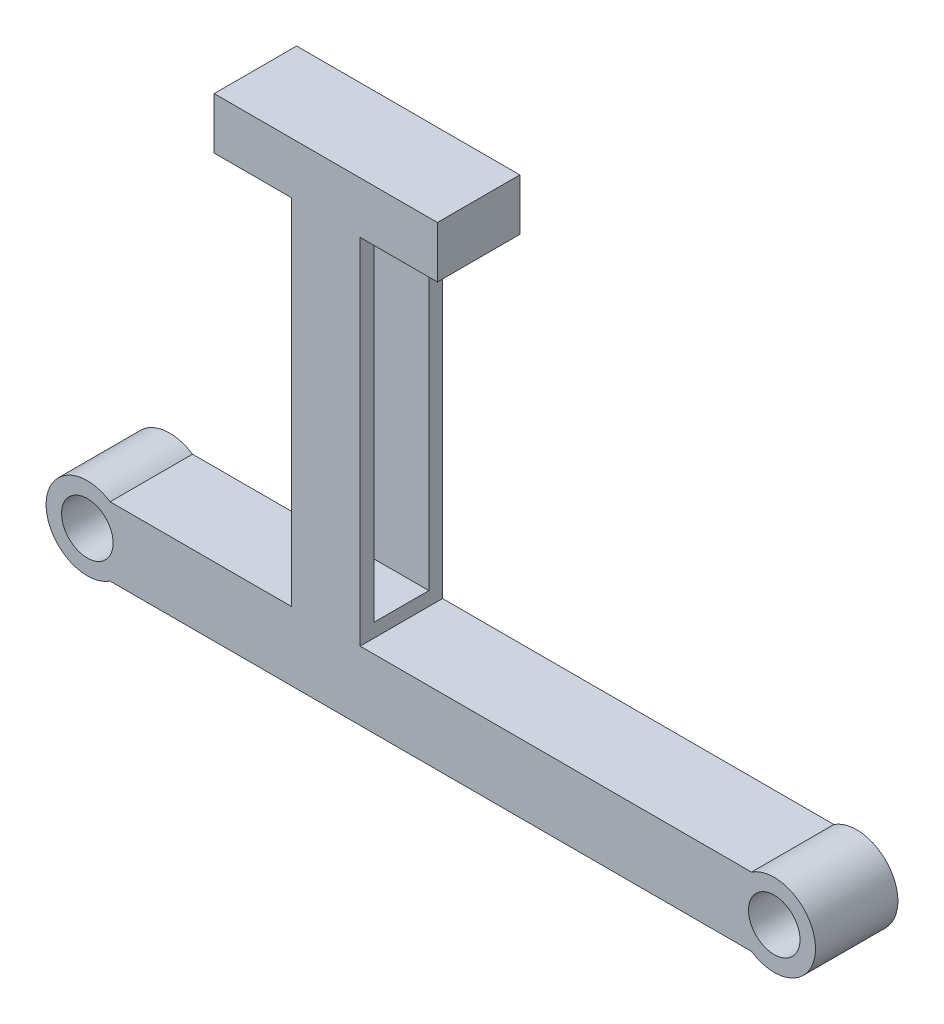
ISO-10303-21;
HEADER;
FILE_DESCRIPTION(('STEP AP214'),'2;1');
FILE_NAME('part.step','',(''),(''),'','','');
FILE_SCHEMA(('AUTOMOTIVE_DESIGN { 1 0 10303 214 1 1 1 1 }'));
ENDSEC;
DATA;
#1=APPLICATION_CONTEXT('core data for automotive mechanical design processes');
#2=APPLICATION_PROTOCOL_DEFINITION('international standard','automotive_design',2000,#1);
#3=PRODUCT_CONTEXT('',#1,'mechanical');
#4=PRODUCT('Part','Part','',(#3));
#5=PRODUCT_RELATED_PRODUCT_CATEGORY('part','',(#4));
#6=PRODUCT_DEFINITION_FORMATION('','',#4);
#7=PRODUCT_DEFINITION_CONTEXT('part definition',#1,'design');
#8=PRODUCT_DEFINITION('design','',#6,#7);
#9=PRODUCT_DEFINITION_SHAPE('','',#8);
#10=(LENGTH_UNIT() NAMED_UNIT(*) SI_UNIT(.MILLI.,.METRE.));
#11=(NAMED_UNIT(*) PLANE_ANGLE_UNIT() SI_UNIT($,.RADIAN.));
#12=(NAMED_UNIT(*) SI_UNIT($,.STERADIAN.) SOLID_ANGLE_UNIT());
#13=UNCERTAINTY_MEASURE_WITH_UNIT(LENGTH_MEASURE(1.E-05),#10,'distance_accuracy_value','');
#14=(GEOMETRIC_REPRESENTATION_CONTEXT(3) GLOBAL_UNCERTAINTY_ASSIGNED_CONTEXT((#13)) GLOBAL_UNIT_ASSIGNED_CONTEXT((#10,
#11,#12)) REPRESENTATION_CONTEXT('',''));
#15=CARTESIAN_POINT('',(0.,0.,0.));
#16=DIRECTION('',(0.,0.,1.));
#17=DIRECTION('',(1.,0.,0.));
#18=AXIS2_PLACEMENT_3D('',#15,#16,#17);
#19=CARTESIAN_POINT('',(144.282113555684,-3.25265389483817,12.));
#20=DIRECTION('',(0.,0.,-1.));
#21=DIRECTION('',(-1.,0.,0.));
#22=AXIS2_PLACEMENT_3D('',#19,#20,#21);
#23=CYLINDRICAL_SURFACE('',#22,7.50000000000001);
#24=CARTESIAN_POINT('',(144.282113555684,-3.25265389483817,12.));
#25=DIRECTION('',(0.,0.,1.));
#26=DIRECTION('',(1.,0.,0.));
#27=AXIS2_PLACEMENT_3D('',#24,#25,#26);
#28=CIRCLE('',#27,7.50000000000001);
#29=CARTESIAN_POINT('',(151.782113555684,-3.25265389483817,12.));
#30=VERTEX_POINT('',#29);
#31=EDGE_CURVE('E478',#30,#30,#28,.T.);
#32=ORIENTED_EDGE('',*,*,#31,.T.);
#33=EDGE_LOOP('',(#32));
#34=FACE_BOUND('',#33,.T.);
#35=CARTESIAN_POINT('',(144.282113555684,-3.25265389483817,-12.));
#36=DIRECTION('',(0.,0.,1.));
#37=DIRECTION('',(1.,0.,0.));
#38=AXIS2_PLACEMENT_3D('',#35,#36,#37);
#39=CIRCLE('',#38,7.50000000000001);
#40=CARTESIAN_POINT('',(151.782113555684,-3.25265389483817,-12.));
#41=VERTEX_POINT('',#40);
#42=EDGE_CURVE('E483',#41,#41,#39,.T.);
#43=ORIENTED_EDGE('',*,*,#42,.F.);
#44=EDGE_LOOP('',(#43));
#45=FACE_BOUND('',#44,.T.);
#46=ADVANCED_FACE('F277',(#34,#45),#23,.F.);
#47=CARTESIAN_POINT('',(-55.7178864443161,-3.25265389483817,12.));
#48=DIRECTION('',(0.,0.,-1.));
#49=DIRECTION('',(-1.,0.,0.));
#50=AXIS2_PLACEMENT_3D('',#47,#48,#49);
#51=CYLINDRICAL_SURFACE('',#50,7.5);
#52=CARTESIAN_POINT('',(-55.7178864443161,-3.25265389483817,12.));
#53=DIRECTION('',(0.,0.,1.));
#54=DIRECTION('',(1.,0.,0.));
#55=AXIS2_PLACEMENT_3D('',#52,#53,#54);
#56=CIRCLE('',#55,7.5);
#57=CARTESIAN_POINT('',(-48.2178864443161,-3.25265389483817,12.));
#58=VERTEX_POINT('',#57);
#59=EDGE_CURVE('E467',#58,#58,#56,.T.);
#60=ORIENTED_EDGE('',*,*,#59,.T.);
#61=EDGE_LOOP('',(#60));
#62=FACE_BOUND('',#61,.T.);
#63=CARTESIAN_POINT('',(-55.7178864443161,-3.25265389483817,-12.));
#64=DIRECTION('',(0.,0.,1.));
#65=DIRECTION('',(1.,0.,0.));
#66=AXIS2_PLACEMENT_3D('',#63,#64,#65);
#67=CIRCLE('',#66,7.5);
#68=CARTESIAN_POINT('',(-48.2178864443161,-3.25265389483817,-12.));
#69=VERTEX_POINT('',#68);
#70=EDGE_CURVE('E472',#69,#69,#67,.T.);
#71=ORIENTED_EDGE('',*,*,#70,.F.);
#72=EDGE_LOOP('',(#71));
#73=FACE_BOUND('',#72,.T.);
#74=ADVANCED_FACE('F584',(#62,#73),#51,.F.);
#75=CARTESIAN_POINT('',(-55.7178864443161,-3.25265389483817,12.));
#76=DIRECTION('',(0.,0.,-1.));
#77=DIRECTION('',(-1.,0.,0.));
#78=AXIS2_PLACEMENT_3D('',#75,#76,#77);
#79=CYLINDRICAL_SURFACE('',#78,12.);
#80=CARTESIAN_POINT('',(-55.7178864443161,-3.25265389483817,-12.));
#81=DIRECTION('',(0.,0.,1.));
#82=DIRECTION('',(1.,0.,0.));
#83=AXIS2_PLACEMENT_3D('',#80,#81,#82);
#84=CIRCLE('',#83,12.);
#85=CARTESIAN_POINT('',(-49.0846368636053,6.74734610516182,-12.));
#86=VERTEX_POINT('',#85);
#87=CARTESIAN_POINT('',(-49.0846368636054,-13.2526538948382,-12.));
#88=VERTEX_POINT('',#87);
#89=EDGE_CURVE('E470',#86,#88,#84,.T.);
#90=ORIENTED_EDGE('',*,*,#89,.T.);
#91=DIRECTION('',(0.,0.,1.));
#92=VECTOR('',#91,1.);
#93=CARTESIAN_POINT('',(-49.0846368636054,-13.2526538948382,-12.));
#94=LINE('',#93,#92);
#95=CARTESIAN_POINT('',(-49.0846368636054,-13.2526538948382,12.));
#96=VERTEX_POINT('',#95);
#97=EDGE_CURVE('E448',#88,#96,#94,.T.);
#98=ORIENTED_EDGE('',*,*,#97,.T.);
#99=CARTESIAN_POINT('',(-55.7178864443161,-3.25265389483817,12.));
#100=DIRECTION('',(0.,0.,1.));
#101=DIRECTION('',(1.,0.,0.));
#102=AXIS2_PLACEMENT_3D('',#99,#100,#101);
#103=CIRCLE('',#102,12.);
#104=CARTESIAN_POINT('',(-49.0846368636053,6.74734610516183,12.));
#105=VERTEX_POINT('',#104);
#106=EDGE_CURVE('E464',#105,#96,#103,.T.);
#107=ORIENTED_EDGE('',*,*,#106,.F.);
#108=DIRECTION('',(0.,0.,1.));
#109=VECTOR('',#108,1.);
#110=CARTESIAN_POINT('',(-49.0846368636053,6.74734610516183,-12.));
#111=LINE('',#110,#109);
#112=EDGE_CURVE('E445',#86,#105,#111,.T.);
#113=ORIENTED_EDGE('',*,*,#112,.F.);
#114=EDGE_LOOP('',(#90,#98,#107,#113));
#115=FACE_BOUND('',#114,.T.);
#116=ADVANCED_FACE('F582',(#115),#79,.T.);
#117=CARTESIAN_POINT('',(144.282113555684,-3.25265389483817,12.));
#118=DIRECTION('',(0.,0.,-1.));
#119=DIRECTION('',(-1.,0.,0.));
#120=AXIS2_PLACEMENT_3D('',#117,#118,#119);
#121=CYLINDRICAL_SURFACE('',#120,12.);
#122=CARTESIAN_POINT('',(144.282113555684,-3.25265389483817,12.));
#123=DIRECTION('',(0.,0.,1.));
#124=DIRECTION('',(1.,0.,0.));
#125=AXIS2_PLACEMENT_3D('',#122,#123,#124);
#126=CIRCLE('',#125,12.);
#127=CARTESIAN_POINT('',(137.648863974973,-13.2526538948382,12.));
#128=VERTEX_POINT('',#127);
#129=CARTESIAN_POINT('',(137.648863974973,6.74734610516184,12.));
#130=VERTEX_POINT('',#129);
#131=EDGE_CURVE('E475',#128,#130,#126,.T.);
#132=ORIENTED_EDGE('',*,*,#131,.F.);
#133=DIRECTION('',(0.,0.,1.));
#134=VECTOR('',#133,1.);
#135=CARTESIAN_POINT('',(137.648863974973,-13.2526538948382,-12.));
#136=LINE('',#135,#134);
#137=CARTESIAN_POINT('',(137.648863974973,-13.2526538948382,-12.));
#138=VERTEX_POINT('',#137);
#139=EDGE_CURVE('E392',#138,#128,#136,.T.);
#140=ORIENTED_EDGE('',*,*,#139,.F.);
#141=CARTESIAN_POINT('',(144.282113555684,-3.25265389483817,-12.));
#142=DIRECTION('',(0.,0.,1.));
#143=DIRECTION('',(1.,0.,0.));
#144=AXIS2_PLACEMENT_3D('',#141,#142,#143);
#145=CIRCLE('',#144,12.);
#146=CARTESIAN_POINT('',(137.648863974973,6.74734610516184,-12.));
#147=VERTEX_POINT('',#146);
#148=EDGE_CURVE('E481',#138,#147,#145,.T.);
#149=ORIENTED_EDGE('',*,*,#148,.T.);
#150=DIRECTION('',(0.,0.,1.));
#151=VECTOR('',#150,1.);
#152=CARTESIAN_POINT('',(137.648863974973,6.74734610516183,-12.));
#153=LINE('',#152,#151);
#154=EDGE_CURVE('E443',#147,#130,#153,.T.);
#155=ORIENTED_EDGE('',*,*,#154,.T.);
#156=EDGE_LOOP('',(#132,#140,#149,#155));
#157=FACE_BOUND('',#156,.T.);
#158=ADVANCED_FACE('F575',(#157),#121,.T.);
#159=CARTESIAN_POINT('',(0.,-13.2526538948382,-12.));
#160=DIRECTION('',(0.,1.,0.));
#161=DIRECTION('',(-1.,0.,0.));
#162=AXIS2_PLACEMENT_3D('',#159,#160,#161);
#163=PLANE('',#162);
#164=ORIENTED_EDGE('',*,*,#139,.T.);
#165=DIRECTION('',(-1.,0.,0.));
#166=VECTOR('',#165,1.);
#167=CARTESIAN_POINT('',(0.,-13.2526538948382,12.));
#168=LINE('',#167,#166);
#169=EDGE_CURVE('E457',#128,#96,#168,.T.);
#170=ORIENTED_EDGE('',*,*,#169,.T.);
#171=ORIENTED_EDGE('',*,*,#97,.F.);
#172=DIRECTION('',(-1.,0.,0.));
#173=VECTOR('',#172,1.);
#174=CARTESIAN_POINT('',(0.,-13.2526538948382,-12.));
#175=LINE('',#174,#173);
#176=EDGE_CURVE('E446',#138,#88,#175,.T.);
#177=ORIENTED_EDGE('',*,*,#176,.F.);
#178=EDGE_LOOP('',(#164,#170,#171,#177));
#179=FACE_BOUND('',#178,.T.);
#180=ADVANCED_FACE('F580',(#179),#163,.F.);
#181=CARTESIAN_POINT('',(0.,0.,12.));
#182=DIRECTION('',(0.,0.,1.));
#183=DIRECTION('',(1.,0.,0.));
#184=AXIS2_PLACEMENT_3D('',#181,#182,#183);
#185=PLANE('',#184);
#186=ORIENTED_EDGE('',*,*,#169,.F.);
#187=ORIENTED_EDGE('',*,*,#131,.T.);
#188=DIRECTION('',(1.,0.,0.));
#189=VECTOR('',#188,1.);
#190=CARTESIAN_POINT('',(0.,6.74734610516183,12.));
#191=LINE('',#190,#189);
#192=CARTESIAN_POINT('',(23.7121135556839,6.7473461051618,12.));
#193=VERTEX_POINT('',#192);
#194=EDGE_CURVE('E463',#193,#130,#191,.T.);
#195=ORIENTED_EDGE('',*,*,#194,.F.);
#196=DIRECTION('',(0.,1.,0.));
#197=VECTOR('',#196,1.);
#198=CARTESIAN_POINT('',(23.7121135556839,6.7473461051618,12.));
#199=LINE('',#198,#197);
#200=CARTESIAN_POINT('',(23.7121135556839,109.817346105162,12.));
#201=VERTEX_POINT('',#200);
#202=EDGE_CURVE('E497',#193,#201,#199,.T.);
#203=ORIENTED_EDGE('',*,*,#202,.T.);
#204=DIRECTION('',(1.,0.,0.));
#205=VECTOR('',#204,1.);
#206=CARTESIAN_POINT('',(-18.7878864443161,109.817346105162,12.));
#207=LINE('',#206,#205);
#208=CARTESIAN_POINT('',(46.2121135556839,109.817346105162,12.));
#209=VERTEX_POINT('',#208);
#210=EDGE_CURVE('E435',#201,#209,#207,.T.);
#211=ORIENTED_EDGE('',*,*,#210,.T.);
#212=DIRECTION('',(0.,1.,0.));
#213=VECTOR('',#212,1.);
#214=CARTESIAN_POINT('',(46.2121135556839,109.817346105162,12.));
#215=LINE('',#214,#213);
#216=CARTESIAN_POINT('',(46.2121135556839,124.817346105162,12.));
#217=VERTEX_POINT('',#216);
#218=EDGE_CURVE('E436',#209,#217,#215,.T.);
#219=ORIENTED_EDGE('',*,*,#218,.T.);
#220=DIRECTION('',(1.,0.,0.));
#221=VECTOR('',#220,1.);
#222=CARTESIAN_POINT('',(-18.7878864443161,124.817346105162,12.));
#223=LINE('',#222,#221);
#224=CARTESIAN_POINT('',(-18.7878864443161,124.817346105162,12.));
#225=VERTEX_POINT('',#224);
#226=EDGE_CURVE('E439',#225,#217,#223,.T.);
#227=ORIENTED_EDGE('',*,*,#226,.F.);
#228=DIRECTION('',(0.,1.,0.));
#229=VECTOR('',#228,1.);
#230=CARTESIAN_POINT('',(-18.7878864443161,109.817346105162,12.));
#231=LINE('',#230,#229);
#232=CARTESIAN_POINT('',(-18.7878864443161,109.817346105162,12.));
#233=VERTEX_POINT('',#232);
#234=EDGE_CURVE('E429',#233,#225,#231,.T.);
#235=ORIENTED_EDGE('',*,*,#234,.F.);
#236=CARTESIAN_POINT('',(3.71211355568388,109.817346105162,12.));
#237=VERTEX_POINT('',#236);
#238=EDGE_CURVE('E432',#233,#237,#207,.T.);
#239=ORIENTED_EDGE('',*,*,#238,.T.);
#240=DIRECTION('',(0.,1.,0.));
#241=VECTOR('',#240,1.);
#242=CARTESIAN_POINT('',(3.71211355568387,6.74734610516179,12.));
#243=LINE('',#242,#241);
#244=CARTESIAN_POINT('',(3.71211355568387,6.74734610516179,12.));
#245=VERTEX_POINT('',#244);
#246=EDGE_CURVE('E490',#245,#237,#243,.T.);
#247=ORIENTED_EDGE('',*,*,#246,.F.);
#248=EDGE_CURVE('E460',#105,#245,#191,.T.);
#249=ORIENTED_EDGE('',*,*,#248,.F.);
#250=ORIENTED_EDGE('',*,*,#106,.T.);
#251=EDGE_LOOP('',(#186,#187,#195,#203,#211,#219,#227,#235,#239,#247,#249,#250));
#252=FACE_BOUND('',#251,.T.);
#253=ORIENTED_EDGE('',*,*,#59,.F.);
#254=EDGE_LOOP('',(#253));
#255=FACE_BOUND('',#254,.T.);
#256=ORIENTED_EDGE('',*,*,#31,.F.);
#257=EDGE_LOOP('',(#256));
#258=FACE_BOUND('',#257,.T.);
#259=ADVANCED_FACE('F547',(#252,#255,#258),#185,.T.);
#260=CARTESIAN_POINT('',(0.,6.74734610516183,-12.));
#261=DIRECTION('',(0.,-1.,0.));
#262=DIRECTION('',(1.,0.,0.));
#263=AXIS2_PLACEMENT_3D('',#260,#261,#262);
#264=PLANE('',#263);
#265=ORIENTED_EDGE('',*,*,#112,.T.);
#266=ORIENTED_EDGE('',*,*,#248,.T.);
#267=DIRECTION('',(0.,0.,-1.));
#268=VECTOR('',#267,1.);
#269=CARTESIAN_POINT('',(3.71211355568387,6.74734610516179,12.));
#270=LINE('',#269,#268);
#271=CARTESIAN_POINT('',(3.71211355568387,6.74734610516179,-12.));
#272=VERTEX_POINT('',#271);
#273=EDGE_CURVE('E492',#245,#272,#270,.T.);
#274=ORIENTED_EDGE('',*,*,#273,.T.);
#275=DIRECTION('',(1.,0.,0.));
#276=VECTOR('',#275,1.);
#277=CARTESIAN_POINT('',(0.,6.74734610516183,-12.));
#278=LINE('',#277,#276);
#279=EDGE_CURVE('E453',#86,#272,#278,.T.);
#280=ORIENTED_EDGE('',*,*,#279,.F.);
#281=EDGE_LOOP('',(#265,#266,#274,#280));
#282=FACE_BOUND('',#281,.T.);
#283=ADVANCED_FACE('F542',(#282),#264,.F.);
#284=CARTESIAN_POINT('',(0.,0.,-12.));
#285=DIRECTION('',(0.,0.,1.));
#286=DIRECTION('',(1.,0.,0.));
#287=AXIS2_PLACEMENT_3D('',#284,#285,#286);
#288=PLANE('',#287);
#289=CARTESIAN_POINT('',(23.7121135556839,6.7473461051618,-12.));
#290=VERTEX_POINT('',#289);
#291=EDGE_CURVE('E456',#290,#147,#278,.T.);
#292=ORIENTED_EDGE('',*,*,#291,.T.);
#293=ORIENTED_EDGE('',*,*,#148,.F.);
#294=ORIENTED_EDGE('',*,*,#176,.T.);
#295=ORIENTED_EDGE('',*,*,#89,.F.);
#296=ORIENTED_EDGE('',*,*,#279,.T.);
#297=DIRECTION('',(0.,1.,0.));
#298=VECTOR('',#297,1.);
#299=CARTESIAN_POINT('',(3.71211355568387,6.74734610516179,-12.));
#300=LINE('',#299,#298);
#301=CARTESIAN_POINT('',(3.71211355568388,109.817346105162,-12.));
#302=VERTEX_POINT('',#301);
#303=EDGE_CURVE('E500',#272,#302,#300,.T.);
#304=ORIENTED_EDGE('',*,*,#303,.T.);
#305=DIRECTION('',(1.,0.,0.));
#306=VECTOR('',#305,1.);
#307=CARTESIAN_POINT('',(-18.7878864443161,109.817346105162,-12.));
#308=LINE('',#307,#306);
#309=CARTESIAN_POINT('',(-18.7878864443161,109.817346105162,-12.));
#310=VERTEX_POINT('',#309);
#311=EDGE_CURVE('E420',#310,#302,#308,.T.);
#312=ORIENTED_EDGE('',*,*,#311,.F.);
#313=DIRECTION('',(0.,1.,0.));
#314=VECTOR('',#313,1.);
#315=CARTESIAN_POINT('',(-18.7878864443161,109.817346105162,-12.));
#316=LINE('',#315,#314);
#317=CARTESIAN_POINT('',(-18.7878864443161,124.817346105162,-12.));
#318=VERTEX_POINT('',#317);
#319=EDGE_CURVE('E418',#310,#318,#316,.T.);
#320=ORIENTED_EDGE('',*,*,#319,.T.);
#321=DIRECTION('',(1.,0.,0.));
#322=VECTOR('',#321,1.);
#323=CARTESIAN_POINT('',(-18.7878864443161,124.817346105162,-12.));
#324=LINE('',#323,#322);
#325=CARTESIAN_POINT('',(46.2121135556839,124.817346105162,-12.));
#326=VERTEX_POINT('',#325);
#327=EDGE_CURVE('E427',#318,#326,#324,.T.);
#328=ORIENTED_EDGE('',*,*,#327,.T.);
#329=DIRECTION('',(0.,1.,0.));
#330=VECTOR('',#329,1.);
#331=CARTESIAN_POINT('',(46.2121135556839,109.817346105162,-12.));
#332=LINE('',#331,#330);
#333=CARTESIAN_POINT('',(46.2121135556839,109.817346105162,-12.));
#334=VERTEX_POINT('',#333);
#335=EDGE_CURVE('E424',#334,#326,#332,.T.);
#336=ORIENTED_EDGE('',*,*,#335,.F.);
#337=CARTESIAN_POINT('',(23.7121135556839,109.817346105162,-12.));
#338=VERTEX_POINT('',#337);
#339=EDGE_CURVE('E423',#338,#334,#308,.T.);
#340=ORIENTED_EDGE('',*,*,#339,.F.);
#341=DIRECTION('',(0.,1.,0.));
#342=VECTOR('',#341,1.);
#343=CARTESIAN_POINT('',(23.7121135556839,6.7473461051618,-12.));
#344=LINE('',#343,#342);
#345=EDGE_CURVE('E410',#290,#338,#344,.T.);
#346=ORIENTED_EDGE('',*,*,#345,.F.);
#347=EDGE_LOOP('',(#292,#293,#294,#295,#296,#304,#312,#320,#328,#336,#340,#346));
#348=FACE_BOUND('',#347,.T.);
#349=ORIENTED_EDGE('',*,*,#42,.T.);
#350=EDGE_LOOP('',(#349));
#351=FACE_BOUND('',#350,.T.);
#352=ORIENTED_EDGE('',*,*,#70,.T.);
#353=EDGE_LOOP('',(#352));
#354=FACE_BOUND('',#353,.T.);
#355=ADVANCED_FACE('F527',(#348,#351,#354),#288,.F.);
#356=CARTESIAN_POINT('',(3.71211355568387,6.74734610516179,12.));
#357=DIRECTION('',(-1.,0.,0.));
#358=DIRECTION('',(0.,-1.,0.));
#359=AXIS2_PLACEMENT_3D('',#356,#357,#358);
#360=PLANE('',#359);
#361=DIRECTION('',(0.,1.,0.));
#362=VECTOR('',#361,1.);
#363=CARTESIAN_POINT('',(3.71211355568387,6.74734610516179,8.));
#364=LINE('',#363,#362);
#365=CARTESIAN_POINT('',(3.71211355568388,10.7473461051618,8.));
#366=VERTEX_POINT('',#365);
#367=CARTESIAN_POINT('',(3.71211355568388,105.817346105162,8.));
#368=VERTEX_POINT('',#367);
#369=EDGE_CURVE('E442',#366,#368,#364,.T.);
#370=ORIENTED_EDGE('',*,*,#369,.F.);
#371=DIRECTION('',(0.,0.,1.));
#372=VECTOR('',#371,1.);
#373=CARTESIAN_POINT('',(3.71211355568387,10.7473461051618,12.));
#374=LINE('',#373,#372);
#375=CARTESIAN_POINT('',(3.71211355568387,10.7473461051618,-8.));
#376=VERTEX_POINT('',#375);
#377=EDGE_CURVE('E509',#376,#366,#374,.T.);
#378=ORIENTED_EDGE('',*,*,#377,.F.);
#379=DIRECTION('',(0.,-1.,0.));
#380=VECTOR('',#379,1.);
#381=CARTESIAN_POINT('',(3.71211355568387,6.74734610516179,-8.));
#382=LINE('',#381,#380);
#383=CARTESIAN_POINT('',(3.71211355568388,105.817346105162,-8.));
#384=VERTEX_POINT('',#383);
#385=EDGE_CURVE('E399',#384,#376,#382,.T.);
#386=ORIENTED_EDGE('',*,*,#385,.F.);
#387=DIRECTION('',(0.,0.,-1.));
#388=VECTOR('',#387,1.);
#389=CARTESIAN_POINT('',(3.71211355568388,105.817346105162,12.));
#390=LINE('',#389,#388);
#391=EDGE_CURVE('E506',#368,#384,#390,.T.);
#392=ORIENTED_EDGE('',*,*,#391,.F.);
#393=EDGE_LOOP('',(#370,#378,#386,#392));
#394=FACE_BOUND('',#393,.T.);
#395=DIRECTION('',(0.,0.,-1.));
#396=VECTOR('',#395,1.);
#397=CARTESIAN_POINT('',(3.71211355568388,109.817346105162,12.));
#398=LINE('',#397,#396);
#399=EDGE_CURVE('E486',#237,#302,#398,.T.);
#400=ORIENTED_EDGE('',*,*,#399,.T.);
#401=ORIENTED_EDGE('',*,*,#303,.F.);
#402=ORIENTED_EDGE('',*,*,#273,.F.);
#403=ORIENTED_EDGE('',*,*,#246,.T.);
#404=EDGE_LOOP('',(#400,#401,#402,#403));
#405=FACE_BOUND('',#404,.T.);
#406=ADVANCED_FACE('F523',(#394,#405),#360,.T.);
#407=ORIENTED_EDGE('',*,*,#291,.F.);
#408=DIRECTION('',(0.,0.,-1.));
#409=VECTOR('',#408,1.);
#410=CARTESIAN_POINT('',(23.7121135556839,6.7473461051618,12.));
#411=LINE('',#410,#409);
#412=EDGE_CURVE('E489',#193,#290,#411,.T.);
#413=ORIENTED_EDGE('',*,*,#412,.F.);
#414=ORIENTED_EDGE('',*,*,#194,.T.);
#415=ORIENTED_EDGE('',*,*,#154,.F.);
#416=EDGE_LOOP('',(#407,#413,#414,#415));
#417=FACE_BOUND('',#416,.T.);
#418=ADVANCED_FACE('F526',(#417),#264,.F.);
#419=CARTESIAN_POINT('',(23.7121135556839,6.7473461051618,12.));
#420=DIRECTION('',(-1.,0.,0.));
#421=DIRECTION('',(0.,-1.,0.));
#422=AXIS2_PLACEMENT_3D('',#419,#420,#421);
#423=PLANE('',#422);
#424=DIRECTION('',(0.,0.,1.));
#425=VECTOR('',#424,1.);
#426=CARTESIAN_POINT('',(23.7121135556839,10.7473461051618,12.));
#427=LINE('',#426,#425);
#428=CARTESIAN_POINT('',(23.7121135556839,10.7473461051618,-8.));
#429=VERTEX_POINT('',#428);
#430=CARTESIAN_POINT('',(23.7121135556839,10.7473461051618,8.));
#431=VERTEX_POINT('',#430);
#432=EDGE_CURVE('E387',#429,#431,#427,.T.);
#433=ORIENTED_EDGE('',*,*,#432,.T.);
#434=DIRECTION('',(0.,1.,0.));
#435=VECTOR('',#434,1.);
#436=CARTESIAN_POINT('',(23.7121135556839,6.7473461051618,8.));
#437=LINE('',#436,#435);
#438=CARTESIAN_POINT('',(23.7121135556839,105.817346105162,8.));
#439=VERTEX_POINT('',#438);
#440=EDGE_CURVE('E12',#431,#439,#437,.T.);
#441=ORIENTED_EDGE('',*,*,#440,.T.);
#442=DIRECTION('',(0.,0.,-1.));
#443=VECTOR('',#442,1.);
#444=CARTESIAN_POINT('',(23.7121135556839,105.817346105162,12.));
#445=LINE('',#444,#443);
#446=CARTESIAN_POINT('',(23.7121135556839,105.817346105162,-8.));
#447=VERTEX_POINT('',#446);
#448=EDGE_CURVE('E285',#439,#447,#445,.T.);
#449=ORIENTED_EDGE('',*,*,#448,.T.);
#450=DIRECTION('',(0.,-1.,0.));
#451=VECTOR('',#450,1.);
#452=CARTESIAN_POINT('',(23.7121135556839,6.7473461051618,-8.));
#453=LINE('',#452,#451);
#454=EDGE_CURVE('E391',#447,#429,#453,.T.);
#455=ORIENTED_EDGE('',*,*,#454,.T.);
#456=EDGE_LOOP('',(#433,#441,#449,#455));
#457=FACE_BOUND('',#456,.T.);
#458=ORIENTED_EDGE('',*,*,#412,.T.);
#459=ORIENTED_EDGE('',*,*,#345,.T.);
#460=DIRECTION('',(0.,0.,-1.));
#461=VECTOR('',#460,1.);
#462=CARTESIAN_POINT('',(23.7121135556839,109.817346105162,12.));
#463=LINE('',#462,#461);
#464=EDGE_CURVE('E487',#201,#338,#463,.T.);
#465=ORIENTED_EDGE('',*,*,#464,.F.);
#466=ORIENTED_EDGE('',*,*,#202,.F.);
#467=EDGE_LOOP('',(#458,#459,#465,#466));
#468=FACE_BOUND('',#467,.T.);
#469=ADVANCED_FACE('F404',(#457,#468),#423,.F.);
#470=CARTESIAN_POINT('',(-18.7878864443161,124.817346105162,-12.));
#471=DIRECTION('',(0.,-1.,0.));
#472=DIRECTION('',(0.,0.,-1.));
#473=AXIS2_PLACEMENT_3D('',#470,#471,#472);
#474=PLANE('',#473);
#475=DIRECTION('',(0.,0.,1.));
#476=VECTOR('',#475,1.);
#477=CARTESIAN_POINT('',(-18.7878864443161,124.817346105162,-12.));
#478=LINE('',#477,#476);
#479=EDGE_CURVE('E416',#318,#225,#478,.T.);
#480=ORIENTED_EDGE('',*,*,#479,.T.);
#481=ORIENTED_EDGE('',*,*,#226,.T.);
#482=DIRECTION('',(0.,0.,1.));
#483=VECTOR('',#482,1.);
#484=CARTESIAN_POINT('',(46.2121135556839,124.817346105162,-12.));
#485=LINE('',#484,#483);
#486=EDGE_CURVE('E408',#326,#217,#485,.T.);
#487=ORIENTED_EDGE('',*,*,#486,.F.);
#488=ORIENTED_EDGE('',*,*,#327,.F.);
#489=EDGE_LOOP('',(#480,#481,#487,#488));
#490=FACE_BOUND('',#489,.T.);
#491=ADVANCED_FACE('F279',(#490),#474,.F.);
#492=CARTESIAN_POINT('',(46.2121135556839,109.817346105162,-12.));
#493=DIRECTION('',(1.,0.,0.));
#494=DIRECTION('',(0.,0.,-1.));
#495=AXIS2_PLACEMENT_3D('',#492,#493,#494);
#496=PLANE('',#495);
#497=ORIENTED_EDGE('',*,*,#486,.T.);
#498=ORIENTED_EDGE('',*,*,#218,.F.);
#499=DIRECTION('',(0.,0.,1.));
#500=VECTOR('',#499,1.);
#501=CARTESIAN_POINT('',(46.2121135556839,109.817346105162,-12.));
#502=LINE('',#501,#500);
#503=EDGE_CURVE('E411',#334,#209,#502,.T.);
#504=ORIENTED_EDGE('',*,*,#503,.F.);
#505=ORIENTED_EDGE('',*,*,#335,.T.);
#506=EDGE_LOOP('',(#497,#498,#504,#505));
#507=FACE_BOUND('',#506,.T.);
#508=ADVANCED_FACE('F562',(#507),#496,.T.);
#509=CARTESIAN_POINT('',(-18.7878864443161,109.817346105162,-12.));
#510=DIRECTION('',(1.,0.,0.));
#511=DIRECTION('',(0.,1.,0.));
#512=AXIS2_PLACEMENT_3D('',#509,#510,#511);
#513=PLANE('',#512);
#514=DIRECTION('',(0.,0.,1.));
#515=VECTOR('',#514,1.);
#516=CARTESIAN_POINT('',(-18.7878864443161,109.817346105162,-12.));
#517=LINE('',#516,#515);
#518=EDGE_CURVE('E414',#310,#233,#517,.T.);
#519=ORIENTED_EDGE('',*,*,#518,.T.);
#520=ORIENTED_EDGE('',*,*,#234,.T.);
#521=ORIENTED_EDGE('',*,*,#479,.F.);
#522=ORIENTED_EDGE('',*,*,#319,.F.);
#523=EDGE_LOOP('',(#519,#520,#521,#522));
#524=FACE_BOUND('',#523,.T.);
#525=ADVANCED_FACE('F553',(#524),#513,.F.);
#526=CARTESIAN_POINT('',(-18.7878864443161,109.817346105162,-12.));
#527=DIRECTION('',(0.,-1.,0.));
#528=DIRECTION('',(0.,0.,-1.));
#529=AXIS2_PLACEMENT_3D('',#526,#527,#528);
#530=PLANE('',#529);
#531=ORIENTED_EDGE('',*,*,#399,.F.);
#532=ORIENTED_EDGE('',*,*,#238,.F.);
#533=ORIENTED_EDGE('',*,*,#518,.F.);
#534=ORIENTED_EDGE('',*,*,#311,.T.);
#535=EDGE_LOOP('',(#531,#532,#533,#534));
#536=FACE_BOUND('',#535,.T.);
#537=ADVANCED_FACE('F534',(#536),#530,.T.);
#538=ORIENTED_EDGE('',*,*,#210,.F.);
#539=ORIENTED_EDGE('',*,*,#464,.T.);
#540=ORIENTED_EDGE('',*,*,#339,.T.);
#541=ORIENTED_EDGE('',*,*,#503,.T.);
#542=EDGE_LOOP('',(#538,#539,#540,#541));
#543=FACE_BOUND('',#542,.T.);
#544=ADVANCED_FACE('F565',(#543),#530,.T.);
#545=CARTESIAN_POINT('',(-67.7178864443162,105.817346105162,8.));
#546=DIRECTION('',(0.,0.,1.));
#547=DIRECTION('',(1.,0.,0.));
#548=AXIS2_PLACEMENT_3D('',#545,#546,#547);
#549=PLANE('',#548);
#550=ORIENTED_EDGE('',*,*,#369,.T.);
#551=DIRECTION('',(1.,0.,0.));
#552=VECTOR('',#551,1.);
#553=CARTESIAN_POINT('',(-67.7178864443162,105.817346105162,8.));
#554=LINE('',#553,#552);
#555=EDGE_CURVE('E511',#368,#439,#554,.T.);
#556=ORIENTED_EDGE('',*,*,#555,.T.);
#557=ORIENTED_EDGE('',*,*,#440,.F.);
#558=DIRECTION('',(1.,0.,0.));
#559=VECTOR('',#558,1.);
#560=CARTESIAN_POINT('',(-67.7178864443161,10.7473461051618,8.));
#561=LINE('',#560,#559);
#562=EDGE_CURVE('E297',#366,#431,#561,.T.);
#563=ORIENTED_EDGE('',*,*,#562,.F.);
#564=EDGE_LOOP('',(#550,#556,#557,#563));
#565=FACE_BOUND('',#564,.T.);
#566=ADVANCED_FACE('F517',(#565),#549,.F.);
#567=CARTESIAN_POINT('',(-67.7178864443162,105.817346105162,-8.));
#568=DIRECTION('',(0.,1.,0.));
#569=DIRECTION('',(-1.,0.,0.));
#570=AXIS2_PLACEMENT_3D('',#567,#568,#569);
#571=PLANE('',#570);
#572=ORIENTED_EDGE('',*,*,#391,.T.);
#573=DIRECTION('',(1.,0.,0.));
#574=VECTOR('',#573,1.);
#575=CARTESIAN_POINT('',(-67.7178864443162,105.817346105162,-8.));
#576=LINE('',#575,#574);
#577=EDGE_CURVE('E401',#384,#447,#576,.T.);
#578=ORIENTED_EDGE('',*,*,#577,.T.);
#579=ORIENTED_EDGE('',*,*,#448,.F.);
#580=ORIENTED_EDGE('',*,*,#555,.F.);
#581=EDGE_LOOP('',(#572,#578,#579,#580));
#582=FACE_BOUND('',#581,.T.);
#583=ADVANCED_FACE('F521',(#582),#571,.F.);
#584=CARTESIAN_POINT('',(-67.7178864443161,10.7473461051618,-8.));
#585=DIRECTION('',(0.,0.,-1.));
#586=DIRECTION('',(-1.,0.,0.));
#587=AXIS2_PLACEMENT_3D('',#584,#585,#586);
#588=PLANE('',#587);
#589=ORIENTED_EDGE('',*,*,#385,.T.);
#590=DIRECTION('',(1.,0.,0.));
#591=VECTOR('',#590,1.);
#592=CARTESIAN_POINT('',(-67.7178864443161,10.7473461051618,-8.));
#593=LINE('',#592,#591);
#594=EDGE_CURVE('E292',#376,#429,#593,.T.);
#595=ORIENTED_EDGE('',*,*,#594,.T.);
#596=ORIENTED_EDGE('',*,*,#454,.F.);
#597=ORIENTED_EDGE('',*,*,#577,.F.);
#598=EDGE_LOOP('',(#589,#595,#596,#597));
#599=FACE_BOUND('',#598,.T.);
#600=ADVANCED_FACE('F395',(#599),#588,.F.);
#601=CARTESIAN_POINT('',(-67.7178864443161,10.7473461051618,8.));
#602=DIRECTION('',(0.,-1.,0.));
#603=DIRECTION('',(1.,0.,0.));
#604=AXIS2_PLACEMENT_3D('',#601,#602,#603);
#605=PLANE('',#604);
#606=ORIENTED_EDGE('',*,*,#377,.T.);
#607=ORIENTED_EDGE('',*,*,#562,.T.);
#608=ORIENTED_EDGE('',*,*,#432,.F.);
#609=ORIENTED_EDGE('',*,*,#594,.F.);
#610=EDGE_LOOP('',(#606,#607,#608,#609));
#611=FACE_BOUND('',#610,.T.);
#612=ADVANCED_FACE('F388',(#611),#605,.F.);
#613=CLOSED_SHELL('',(#46,#74,#116,#158,#180,#259,#283,#355,#406,#418,#469,#491,#508,#525,#537,
#544,#566,#583,#600,#612));
#614=MANIFOLD_SOLID_BREP('B2',#613);
#615=ADVANCED_BREP_SHAPE_REPRESENTATION('',(#18,#614),#14);
#616=SHAPE_DEFINITION_REPRESENTATION(#9,#615);
ENDSEC;
END-ISO-10303-21;
